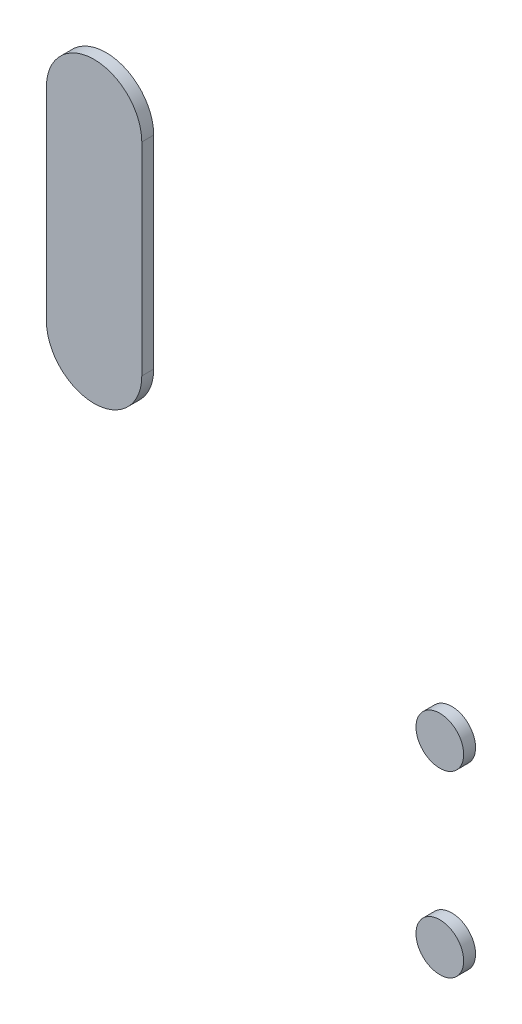
ISO-10303-21;
HEADER;
FILE_DESCRIPTION(('STEP AP214'),'2;1');
FILE_NAME('part.step','',(''),(''),'','','');
FILE_SCHEMA(('AUTOMOTIVE_DESIGN { 1 0 10303 214 1 1 1 1 }'));
ENDSEC;
DATA;
#1=APPLICATION_CONTEXT('core data for automotive mechanical design processes');
#2=APPLICATION_PROTOCOL_DEFINITION('international standard','automotive_design',2000,#1);
#3=PRODUCT_CONTEXT('',#1,'mechanical');
#4=PRODUCT('Part','Part','',(#3));
#5=PRODUCT_RELATED_PRODUCT_CATEGORY('part','',(#4));
#6=PRODUCT_DEFINITION_FORMATION('','',#4);
#7=PRODUCT_DEFINITION_CONTEXT('part definition',#1,'design');
#8=PRODUCT_DEFINITION('design','',#6,#7);
#9=PRODUCT_DEFINITION_SHAPE('','',#8);
#10=(LENGTH_UNIT() NAMED_UNIT(*) SI_UNIT(.MILLI.,.METRE.));
#11=(NAMED_UNIT(*) PLANE_ANGLE_UNIT() SI_UNIT($,.RADIAN.));
#12=(NAMED_UNIT(*) SI_UNIT($,.STERADIAN.) SOLID_ANGLE_UNIT());
#13=UNCERTAINTY_MEASURE_WITH_UNIT(LENGTH_MEASURE(1.E-05),#10,'distance_accuracy_value','');
#14=(GEOMETRIC_REPRESENTATION_CONTEXT(3) GLOBAL_UNCERTAINTY_ASSIGNED_CONTEXT((#13)) GLOBAL_UNIT_ASSIGNED_CONTEXT((#10,
#11,#12)) REPRESENTATION_CONTEXT('',''));
#15=CARTESIAN_POINT('',(0.,0.,0.));
#16=DIRECTION('',(0.,0.,1.));
#17=DIRECTION('',(1.,0.,0.));
#18=AXIS2_PLACEMENT_3D('',#15,#16,#17);
#19=CARTESIAN_POINT('',(29.,-8.99999999999998,-1.));
#20=DIRECTION('',(0.,0.,1.));
#21=DIRECTION('',(1.,0.,0.));
#22=AXIS2_PLACEMENT_3D('',#19,#20,#21);
#23=CYLINDRICAL_SURFACE('',#22,2.);
#24=CARTESIAN_POINT('',(29.,-8.99999999999998,-1.));
#25=DIRECTION('',(0.,0.,1.));
#26=DIRECTION('',(1.,0.,0.));
#27=AXIS2_PLACEMENT_3D('',#24,#25,#26);
#28=CIRCLE('',#27,2.);
#29=CARTESIAN_POINT('',(31.,-8.99999999999998,-1.));
#30=VERTEX_POINT('',#29);
#31=EDGE_CURVE('E48',#30,#30,#28,.T.);
#32=ORIENTED_EDGE('',*,*,#31,.T.);
#33=EDGE_LOOP('',(#32));
#34=FACE_BOUND('',#33,.T.);
#35=CARTESIAN_POINT('',(29.,-8.99999999999998,0.));
#36=DIRECTION('',(0.,0.,1.));
#37=DIRECTION('',(1.,0.,0.));
#38=AXIS2_PLACEMENT_3D('',#35,#36,#37);
#39=CIRCLE('',#38,2.);
#40=CARTESIAN_POINT('',(31.,-8.99999999999998,0.));
#41=VERTEX_POINT('',#40);
#42=EDGE_CURVE('E11',#41,#41,#39,.T.);
#43=ORIENTED_EDGE('',*,*,#42,.F.);
#44=EDGE_LOOP('',(#43));
#45=FACE_BOUND('',#44,.T.);
#46=ADVANCED_FACE('F44',(#34,#45),#23,.T.);
#47=CARTESIAN_POINT('',(29.,-8.99999999999998,-1.));
#48=DIRECTION('',(0.,0.,1.));
#49=DIRECTION('',(1.,0.,0.));
#50=AXIS2_PLACEMENT_3D('',#47,#48,#49);
#51=PLANE('',#50);
#52=ORIENTED_EDGE('',*,*,#31,.F.);
#53=EDGE_LOOP('',(#52));
#54=FACE_BOUND('',#53,.T.);
#55=ADVANCED_FACE('F46',(#54),#51,.F.);
#56=CARTESIAN_POINT('',(29.,-8.99999999999998,0.));
#57=DIRECTION('',(0.,0.,1.));
#58=DIRECTION('',(1.,0.,0.));
#59=AXIS2_PLACEMENT_3D('',#56,#57,#58);
#60=PLANE('',#59);
#61=ORIENTED_EDGE('',*,*,#42,.T.);
#62=EDGE_LOOP('',(#61));
#63=FACE_BOUND('',#62,.T.);
#64=ADVANCED_FACE('F60',(#63),#60,.T.);
#65=CLOSED_SHELL('',(#46,#55,#64));
#66=MANIFOLD_SOLID_BREP('B2',#65);
#67=CARTESIAN_POINT('',(29.,-24.,-1.));
#68=DIRECTION('',(0.,0.,1.));
#69=DIRECTION('',(1.,0.,0.));
#70=AXIS2_PLACEMENT_3D('',#67,#68,#69);
#71=CYLINDRICAL_SURFACE('',#70,2.);
#72=CARTESIAN_POINT('',(29.,-24.,-1.));
#73=DIRECTION('',(0.,0.,1.));
#74=DIRECTION('',(1.,0.,0.));
#75=AXIS2_PLACEMENT_3D('',#72,#73,#74);
#76=CIRCLE('',#75,2.);
#77=CARTESIAN_POINT('',(31.,-24.,-1.));
#78=VERTEX_POINT('',#77);
#79=EDGE_CURVE('E104',#78,#78,#76,.T.);
#80=ORIENTED_EDGE('',*,*,#79,.T.);
#81=EDGE_LOOP('',(#80));
#82=FACE_BOUND('',#81,.T.);
#83=CARTESIAN_POINT('',(29.,-24.,0.));
#84=DIRECTION('',(0.,0.,1.));
#85=DIRECTION('',(1.,0.,0.));
#86=AXIS2_PLACEMENT_3D('',#83,#84,#85);
#87=CIRCLE('',#86,2.);
#88=CARTESIAN_POINT('',(31.,-24.,0.));
#89=VERTEX_POINT('',#88);
#90=EDGE_CURVE('E43',#89,#89,#87,.T.);
#91=ORIENTED_EDGE('',*,*,#90,.F.);
#92=EDGE_LOOP('',(#91));
#93=FACE_BOUND('',#92,.T.);
#94=ADVANCED_FACE('F100',(#82,#93),#71,.T.);
#95=CARTESIAN_POINT('',(29.,-24.,-1.));
#96=DIRECTION('',(0.,0.,1.));
#97=DIRECTION('',(1.,0.,0.));
#98=AXIS2_PLACEMENT_3D('',#95,#96,#97);
#99=PLANE('',#98);
#100=ORIENTED_EDGE('',*,*,#79,.F.);
#101=EDGE_LOOP('',(#100));
#102=FACE_BOUND('',#101,.T.);
#103=ADVANCED_FACE('F102',(#102),#99,.F.);
#104=CARTESIAN_POINT('',(29.,-24.,0.));
#105=DIRECTION('',(0.,0.,1.));
#106=DIRECTION('',(1.,0.,0.));
#107=AXIS2_PLACEMENT_3D('',#104,#105,#106);
#108=PLANE('',#107);
#109=ORIENTED_EDGE('',*,*,#90,.T.);
#110=EDGE_LOOP('',(#109));
#111=FACE_BOUND('',#110,.T.);
#112=ADVANCED_FACE('F116',(#111),#108,.T.);
#113=CLOSED_SHELL('',(#94,#103,#112));
#114=MANIFOLD_SOLID_BREP('B6',#113);
#115=CARTESIAN_POINT('',(0.,5.00000000000001,-1.));
#116=DIRECTION('',(0.,0.,1.));
#117=DIRECTION('',(1.,0.,0.));
#118=AXIS2_PLACEMENT_3D('',#115,#116,#117);
#119=CYLINDRICAL_SURFACE('',#118,4.);
#120=CARTESIAN_POINT('',(0.,5.00000000000001,0.));
#121=DIRECTION('',(0.,0.,1.));
#122=DIRECTION('',(1.,0.,0.));
#123=AXIS2_PLACEMENT_3D('',#120,#121,#122);
#124=CIRCLE('',#123,4.);
#125=CARTESIAN_POINT('',(-4.,5.00000000000001,0.));
#126=VERTEX_POINT('',#125);
#127=CARTESIAN_POINT('',(4.,5.00000000000001,0.));
#128=VERTEX_POINT('',#127);
#129=EDGE_CURVE('E211',#126,#128,#124,.T.);
#130=ORIENTED_EDGE('',*,*,#129,.F.);
#131=DIRECTION('',(0.,0.,1.));
#132=VECTOR('',#131,1.);
#133=CARTESIAN_POINT('',(-4.,5.00000000000001,-1.));
#134=LINE('',#133,#132);
#135=CARTESIAN_POINT('',(-4.,5.00000000000001,-1.));
#136=VERTEX_POINT('',#135);
#137=EDGE_CURVE('E98',#136,#126,#134,.T.);
#138=ORIENTED_EDGE('',*,*,#137,.F.);
#139=CARTESIAN_POINT('',(0.,5.00000000000001,-1.));
#140=DIRECTION('',(0.,0.,1.));
#141=DIRECTION('',(1.,0.,0.));
#142=AXIS2_PLACEMENT_3D('',#139,#140,#141);
#143=CIRCLE('',#142,4.);
#144=CARTESIAN_POINT('',(4.,5.00000000000001,-1.));
#145=VERTEX_POINT('',#144);
#146=EDGE_CURVE('E205',#136,#145,#143,.T.);
#147=ORIENTED_EDGE('',*,*,#146,.T.);
#148=DIRECTION('',(0.,0.,1.));
#149=VECTOR('',#148,1.);
#150=CARTESIAN_POINT('',(4.,5.00000000000001,-1.));
#151=LINE('',#150,#149);
#152=EDGE_CURVE('E150',#145,#128,#151,.T.);
#153=ORIENTED_EDGE('',*,*,#152,.T.);
#154=EDGE_LOOP('',(#130,#138,#147,#153));
#155=FACE_BOUND('',#154,.T.);
#156=ADVANCED_FACE('F147',(#155),#119,.T.);
#157=CARTESIAN_POINT('',(-4.,22.,-1.));
#158=DIRECTION('',(-1.,0.,0.));
#159=DIRECTION('',(0.,-1.,0.));
#160=AXIS2_PLACEMENT_3D('',#157,#158,#159);
#161=PLANE('',#160);
#162=DIRECTION('',(0.,-1.,0.));
#163=VECTOR('',#162,1.);
#164=CARTESIAN_POINT('',(-4.,22.,0.));
#165=LINE('',#164,#163);
#166=CARTESIAN_POINT('',(-4.,22.,0.));
#167=VERTEX_POINT('',#166);
#168=EDGE_CURVE('E207',#167,#126,#165,.T.);
#169=ORIENTED_EDGE('',*,*,#168,.F.);
#170=DIRECTION('',(0.,0.,1.));
#171=VECTOR('',#170,1.);
#172=CARTESIAN_POINT('',(-4.,22.,-1.));
#173=LINE('',#172,#171);
#174=CARTESIAN_POINT('',(-4.,22.,-1.));
#175=VERTEX_POINT('',#174);
#176=EDGE_CURVE('E156',#175,#167,#173,.T.);
#177=ORIENTED_EDGE('',*,*,#176,.F.);
#178=DIRECTION('',(0.,-1.,0.));
#179=VECTOR('',#178,1.);
#180=CARTESIAN_POINT('',(-4.,22.,-1.));
#181=LINE('',#180,#179);
#182=EDGE_CURVE('E202',#175,#136,#181,.T.);
#183=ORIENTED_EDGE('',*,*,#182,.T.);
#184=ORIENTED_EDGE('',*,*,#137,.T.);
#185=EDGE_LOOP('',(#169,#177,#183,#184));
#186=FACE_BOUND('',#185,.T.);
#187=ADVANCED_FACE('F221',(#186),#161,.T.);
#188=CARTESIAN_POINT('',(0.,22.,-1.));
#189=DIRECTION('',(0.,0.,1.));
#190=DIRECTION('',(1.,0.,0.));
#191=AXIS2_PLACEMENT_3D('',#188,#189,#190);
#192=CYLINDRICAL_SURFACE('',#191,4.);
#193=CARTESIAN_POINT('',(0.,22.,0.));
#194=DIRECTION('',(0.,0.,1.));
#195=DIRECTION('',(1.,0.,0.));
#196=AXIS2_PLACEMENT_3D('',#193,#194,#195);
#197=CIRCLE('',#196,4.);
#198=CARTESIAN_POINT('',(4.,22.,0.));
#199=VERTEX_POINT('',#198);
#200=EDGE_CURVE('E197',#199,#167,#197,.T.);
#201=ORIENTED_EDGE('',*,*,#200,.F.);
#202=DIRECTION('',(0.,0.,1.));
#203=VECTOR('',#202,1.);
#204=CARTESIAN_POINT('',(4.,22.,-1.));
#205=LINE('',#204,#203);
#206=CARTESIAN_POINT('',(4.,22.,-1.));
#207=VERTEX_POINT('',#206);
#208=EDGE_CURVE('E192',#207,#199,#205,.T.);
#209=ORIENTED_EDGE('',*,*,#208,.F.);
#210=CARTESIAN_POINT('',(0.,22.,-1.));
#211=DIRECTION('',(0.,0.,1.));
#212=DIRECTION('',(1.,0.,0.));
#213=AXIS2_PLACEMENT_3D('',#210,#211,#212);
#214=CIRCLE('',#213,4.);
#215=EDGE_CURVE('E195',#207,#175,#214,.T.);
#216=ORIENTED_EDGE('',*,*,#215,.T.);
#217=ORIENTED_EDGE('',*,*,#176,.T.);
#218=EDGE_LOOP('',(#201,#209,#216,#217));
#219=FACE_BOUND('',#218,.T.);
#220=ADVANCED_FACE('F194',(#219),#192,.T.);
#221=CARTESIAN_POINT('',(4.,5.00000000000001,-1.));
#222=DIRECTION('',(1.,0.,0.));
#223=DIRECTION('',(0.,1.,0.));
#224=AXIS2_PLACEMENT_3D('',#221,#222,#223);
#225=PLANE('',#224);
#226=DIRECTION('',(0.,1.,0.));
#227=VECTOR('',#226,1.);
#228=CARTESIAN_POINT('',(4.,5.00000000000001,0.));
#229=LINE('',#228,#227);
#230=EDGE_CURVE('E214',#128,#199,#229,.T.);
#231=ORIENTED_EDGE('',*,*,#230,.F.);
#232=ORIENTED_EDGE('',*,*,#152,.F.);
#233=DIRECTION('',(0.,1.,0.));
#234=VECTOR('',#233,1.);
#235=CARTESIAN_POINT('',(4.,5.00000000000001,-1.));
#236=LINE('',#235,#234);
#237=EDGE_CURVE('E201',#145,#207,#236,.T.);
#238=ORIENTED_EDGE('',*,*,#237,.T.);
#239=ORIENTED_EDGE('',*,*,#208,.T.);
#240=EDGE_LOOP('',(#231,#232,#238,#239));
#241=FACE_BOUND('',#240,.T.);
#242=ADVANCED_FACE('F204',(#241),#225,.T.);
#243=CARTESIAN_POINT('',(0.,5.00000000000001,-1.));
#244=DIRECTION('',(0.,0.,1.));
#245=DIRECTION('',(1.,0.,0.));
#246=AXIS2_PLACEMENT_3D('',#243,#244,#245);
#247=PLANE('',#246);
#248=ORIENTED_EDGE('',*,*,#146,.F.);
#249=ORIENTED_EDGE('',*,*,#182,.F.);
#250=ORIENTED_EDGE('',*,*,#215,.F.);
#251=ORIENTED_EDGE('',*,*,#237,.F.);
#252=EDGE_LOOP('',(#248,#249,#250,#251));
#253=FACE_BOUND('',#252,.T.);
#254=ADVANCED_FACE('F200',(#253),#247,.F.);
#255=CARTESIAN_POINT('',(0.,5.00000000000001,0.));
#256=DIRECTION('',(0.,0.,1.));
#257=DIRECTION('',(1.,0.,0.));
#258=AXIS2_PLACEMENT_3D('',#255,#256,#257);
#259=PLANE('',#258);
#260=ORIENTED_EDGE('',*,*,#129,.T.);
#261=ORIENTED_EDGE('',*,*,#230,.T.);
#262=ORIENTED_EDGE('',*,*,#200,.T.);
#263=ORIENTED_EDGE('',*,*,#168,.T.);
#264=EDGE_LOOP('',(#260,#261,#262,#263));
#265=FACE_BOUND('',#264,.T.);
#266=ADVANCED_FACE('F220',(#265),#259,.T.);
#267=CLOSED_SHELL('',(#156,#187,#220,#242,#254,#266));
#268=MANIFOLD_SOLID_BREP('B38',#267);
#269=ADVANCED_BREP_SHAPE_REPRESENTATION('',(#18,#66,#114,#268),#14);
#270=SHAPE_DEFINITION_REPRESENTATION(#9,#269);
ENDSEC;
END-ISO-10303-21;
